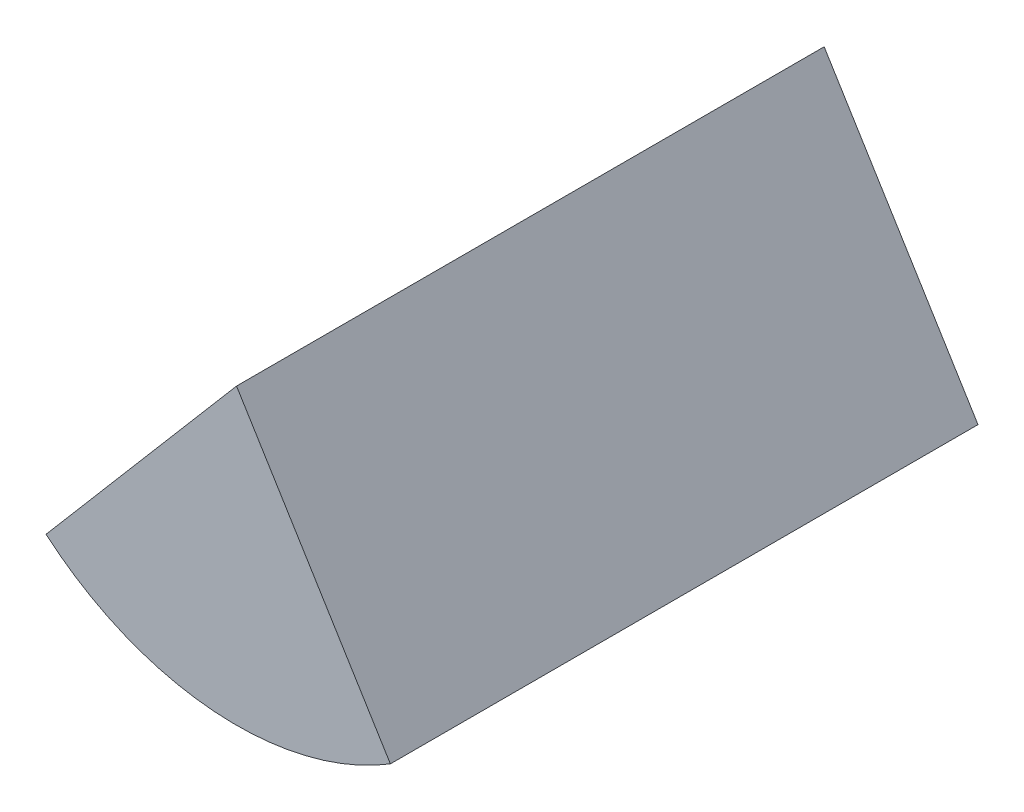
ISO-10303-21;
HEADER;
FILE_DESCRIPTION(('STEP AP214'),'2;1');
FILE_NAME('part.step','',(''),(''),'','','');
FILE_SCHEMA(('AUTOMOTIVE_DESIGN { 1 0 10303 214 1 1 1 1 }'));
ENDSEC;
DATA;
#1=APPLICATION_CONTEXT('core data for automotive mechanical design processes');
#2=APPLICATION_PROTOCOL_DEFINITION('international standard','automotive_design',2000,#1);
#3=PRODUCT_CONTEXT('',#1,'mechanical');
#4=PRODUCT('Part','Part','',(#3));
#5=PRODUCT_RELATED_PRODUCT_CATEGORY('part','',(#4));
#6=PRODUCT_DEFINITION_FORMATION('','',#4);
#7=PRODUCT_DEFINITION_CONTEXT('part definition',#1,'design');
#8=PRODUCT_DEFINITION('design','',#6,#7);
#9=PRODUCT_DEFINITION_SHAPE('','',#8);
#10=(LENGTH_UNIT() NAMED_UNIT(*) SI_UNIT(.MILLI.,.METRE.));
#11=(NAMED_UNIT(*) PLANE_ANGLE_UNIT() SI_UNIT($,.RADIAN.));
#12=(NAMED_UNIT(*) SI_UNIT($,.STERADIAN.) SOLID_ANGLE_UNIT());
#13=UNCERTAINTY_MEASURE_WITH_UNIT(LENGTH_MEASURE(1.E-05),#10,'distance_accuracy_value','');
#14=(GEOMETRIC_REPRESENTATION_CONTEXT(3) GLOBAL_UNCERTAINTY_ASSIGNED_CONTEXT((#13)) GLOBAL_UNIT_ASSIGNED_CONTEXT((#10,
#11,#12)) REPRESENTATION_CONTEXT('',''));
#15=CARTESIAN_POINT('',(0.,0.,0.));
#16=DIRECTION('',(0.,0.,1.));
#17=DIRECTION('',(1.,0.,0.));
#18=AXIS2_PLACEMENT_3D('',#15,#16,#17);
#19=CARTESIAN_POINT('',(0.,0.,50.));
#20=DIRECTION('',(0.761245161772703,-0.648464188431136,0.));
#21=DIRECTION('',(0.648464188431136,0.761245161772703,0.));
#22=AXIS2_PLACEMENT_3D('',#19,#20,#21);
#23=PLANE('',#22);
#24=DIRECTION('',(-0.648464188431136,-0.761245161772703,0.));
#25=VECTOR('',#24,1.);
#26=CARTESIAN_POINT('',(0.,0.,0.));
#27=LINE('',#26,#25);
#28=CARTESIAN_POINT('',(0.,0.,0.));
#29=VERTEX_POINT('',#28);
#30=CARTESIAN_POINT('',(-16.2116047107784,-19.0311290443176,0.));
#31=VERTEX_POINT('',#30);
#32=EDGE_CURVE('E80',#29,#31,#27,.T.);
#33=ORIENTED_EDGE('',*,*,#32,.T.);
#34=DIRECTION('',(0.,0.,-1.));
#35=VECTOR('',#34,1.);
#36=CARTESIAN_POINT('',(-16.2116047107784,-19.0311290443176,50.));
#37=LINE('',#36,#35);
#38=CARTESIAN_POINT('',(-16.2116047107784,-19.0311290443176,50.));
#39=VERTEX_POINT('',#38);
#40=EDGE_CURVE('E11',#39,#31,#37,.T.);
#41=ORIENTED_EDGE('',*,*,#40,.F.);
#42=DIRECTION('',(-0.648464188431136,-0.761245161772703,0.));
#43=VECTOR('',#42,1.);
#44=CARTESIAN_POINT('',(0.,0.,50.));
#45=LINE('',#44,#43);
#46=CARTESIAN_POINT('',(0.,0.,50.));
#47=VERTEX_POINT('',#46);
#48=EDGE_CURVE('E73',#47,#39,#45,.T.);
#49=ORIENTED_EDGE('',*,*,#48,.F.);
#50=DIRECTION('',(0.,0.,-1.));
#51=VECTOR('',#50,1.);
#52=CARTESIAN_POINT('',(0.,0.,50.));
#53=LINE('',#52,#51);
#54=EDGE_CURVE('E81',#47,#29,#53,.T.);
#55=ORIENTED_EDGE('',*,*,#54,.T.);
#56=EDGE_LOOP('',(#33,#41,#49,#55));
#57=FACE_BOUND('',#56,.T.);
#58=ADVANCED_FACE('F33',(#57),#23,.F.);
#59=CARTESIAN_POINT('',(0.,0.,50.));
#60=DIRECTION('',(0.,0.,-1.));
#61=DIRECTION('',(-1.,0.,0.));
#62=AXIS2_PLACEMENT_3D('',#59,#60,#61);
#63=CYLINDRICAL_SURFACE('',#62,25.);
#64=CARTESIAN_POINT('',(0.,0.,0.));
#65=DIRECTION('',(0.,0.,1.));
#66=DIRECTION('',(1.,0.,0.));
#67=AXIS2_PLACEMENT_3D('',#64,#65,#66);
#68=CIRCLE('',#67,25.);
#69=CARTESIAN_POINT('',(13.0900179283328,-21.2990945966238,0.));
#70=VERTEX_POINT('',#69);
#71=EDGE_CURVE('E61',#31,#70,#68,.T.);
#72=ORIENTED_EDGE('',*,*,#71,.T.);
#73=DIRECTION('',(0.,0.,-1.));
#74=VECTOR('',#73,1.);
#75=CARTESIAN_POINT('',(13.0900179283328,-21.2990945966238,50.));
#76=LINE('',#75,#74);
#77=CARTESIAN_POINT('',(13.0900179283328,-21.2990945966238,50.));
#78=VERTEX_POINT('',#77);
#79=EDGE_CURVE('E41',#78,#70,#76,.T.);
#80=ORIENTED_EDGE('',*,*,#79,.F.);
#81=CARTESIAN_POINT('',(0.,0.,50.));
#82=DIRECTION('',(0.,0.,1.));
#83=DIRECTION('',(1.,0.,0.));
#84=AXIS2_PLACEMENT_3D('',#81,#82,#83);
#85=CIRCLE('',#84,25.);
#86=EDGE_CURVE('E69',#39,#78,#85,.T.);
#87=ORIENTED_EDGE('',*,*,#86,.F.);
#88=ORIENTED_EDGE('',*,*,#40,.T.);
#89=EDGE_LOOP('',(#72,#80,#87,#88));
#90=FACE_BOUND('',#89,.T.);
#91=ADVANCED_FACE('F70',(#90),#63,.T.);
#92=CARTESIAN_POINT('',(0.,0.,50.));
#93=DIRECTION('',(-0.85196378386495,-0.52360071713331,0.));
#94=DIRECTION('',(0.52360071713331,-0.85196378386495,0.));
#95=AXIS2_PLACEMENT_3D('',#92,#93,#94);
#96=PLANE('',#95);
#97=DIRECTION('',(-0.52360071713331,0.85196378386495,0.));
#98=VECTOR('',#97,1.);
#99=CARTESIAN_POINT('',(0.,0.,0.));
#100=LINE('',#99,#98);
#101=EDGE_CURVE('E66',#70,#29,#100,.T.);
#102=ORIENTED_EDGE('',*,*,#101,.T.);
#103=ORIENTED_EDGE('',*,*,#54,.F.);
#104=DIRECTION('',(-0.52360071713331,0.85196378386495,0.));
#105=VECTOR('',#104,1.);
#106=CARTESIAN_POINT('',(0.,0.,50.));
#107=LINE('',#106,#105);
#108=EDGE_CURVE('E49',#78,#47,#107,.T.);
#109=ORIENTED_EDGE('',*,*,#108,.F.);
#110=ORIENTED_EDGE('',*,*,#79,.T.);
#111=EDGE_LOOP('',(#102,#103,#109,#110));
#112=FACE_BOUND('',#111,.T.);
#113=ADVANCED_FACE('F92',(#112),#96,.F.);
#114=CARTESIAN_POINT('',(0.,0.,50.));
#115=DIRECTION('',(0.,0.,1.));
#116=DIRECTION('',(1.,0.,0.));
#117=AXIS2_PLACEMENT_3D('',#114,#115,#116);
#118=PLANE('',#117);
#119=ORIENTED_EDGE('',*,*,#48,.T.);
#120=ORIENTED_EDGE('',*,*,#86,.T.);
#121=ORIENTED_EDGE('',*,*,#108,.T.);
#122=EDGE_LOOP('',(#119,#120,#121));
#123=FACE_BOUND('',#122,.T.);
#124=ADVANCED_FACE('F76',(#123),#118,.T.);
#125=CARTESIAN_POINT('',(0.,0.,0.));
#126=DIRECTION('',(0.,0.,1.));
#127=DIRECTION('',(1.,0.,0.));
#128=AXIS2_PLACEMENT_3D('',#125,#126,#127);
#129=PLANE('',#128);
#130=CARTESIAN_POINT('',(-1.17750974227444,-15.9099545476719,0.));
#131=DIRECTION('',(0.,0.,-1.));
#132=DIRECTION('',(-1.,0.,0.));
#133=AXIS2_PLACEMENT_3D('',#130,#131,#132);
#134=CIRCLE('',#133,5.);
#135=CARTESIAN_POINT('',(-6.17750974227444,-15.9099545476719,0.));
#136=VERTEX_POINT('',#135);
#137=EDGE_CURVE('E87',#136,#136,#134,.T.);
#138=ORIENTED_EDGE('',*,*,#137,.F.);
#139=EDGE_LOOP('',(#138));
#140=FACE_BOUND('',#139,.T.);
#141=ORIENTED_EDGE('',*,*,#32,.F.);
#142=ORIENTED_EDGE('',*,*,#101,.F.);
#143=ORIENTED_EDGE('',*,*,#71,.F.);
#144=EDGE_LOOP('',(#141,#142,#143));
#145=FACE_BOUND('',#144,.T.);
#146=ADVANCED_FACE('F93',(#140,#145),#129,.F.);
#147=CARTESIAN_POINT('',(-1.17750974227444,-15.9099545476719,10.));
#148=DIRECTION('',(0.,0.,-1.));
#149=DIRECTION('',(-1.,0.,0.));
#150=AXIS2_PLACEMENT_3D('',#147,#148,#149);
#151=CYLINDRICAL_SURFACE('',#150,5.);
#152=CARTESIAN_POINT('',(-1.17750974227444,-15.9099545476719,10.));
#153=DIRECTION('',(0.,0.,-1.));
#154=DIRECTION('',(-1.,0.,0.));
#155=AXIS2_PLACEMENT_3D('',#152,#153,#154);
#156=CIRCLE('',#155,5.);
#157=CARTESIAN_POINT('',(-6.17750974227444,-15.9099545476719,10.));
#158=VERTEX_POINT('',#157);
#159=EDGE_CURVE('E83',#158,#158,#156,.T.);
#160=ORIENTED_EDGE('',*,*,#159,.F.);
#161=EDGE_LOOP('',(#160));
#162=FACE_BOUND('',#161,.T.);
#163=ORIENTED_EDGE('',*,*,#137,.T.);
#164=EDGE_LOOP('',(#163));
#165=FACE_BOUND('',#164,.T.);
#166=ADVANCED_FACE('F95',(#162,#165),#151,.F.);
#167=CARTESIAN_POINT('',(-1.17750974227444,-15.9099545476719,10.));
#168=DIRECTION('',(0.,0.,-1.));
#169=DIRECTION('',(-1.,0.,0.));
#170=AXIS2_PLACEMENT_3D('',#167,#168,#169);
#171=PLANE('',#170);
#172=ORIENTED_EDGE('',*,*,#159,.T.);
#173=EDGE_LOOP('',(#172));
#174=FACE_BOUND('',#173,.T.);
#175=ADVANCED_FACE('F102',(#174),#171,.T.);
#176=CLOSED_SHELL('',(#58,#91,#113,#124,#146,#166,#175));
#177=MANIFOLD_SOLID_BREP('B2',#176);
#178=ADVANCED_BREP_SHAPE_REPRESENTATION('',(#18,#177),#14);
#179=SHAPE_DEFINITION_REPRESENTATION(#9,#178);
ENDSEC;
END-ISO-10303-21;
